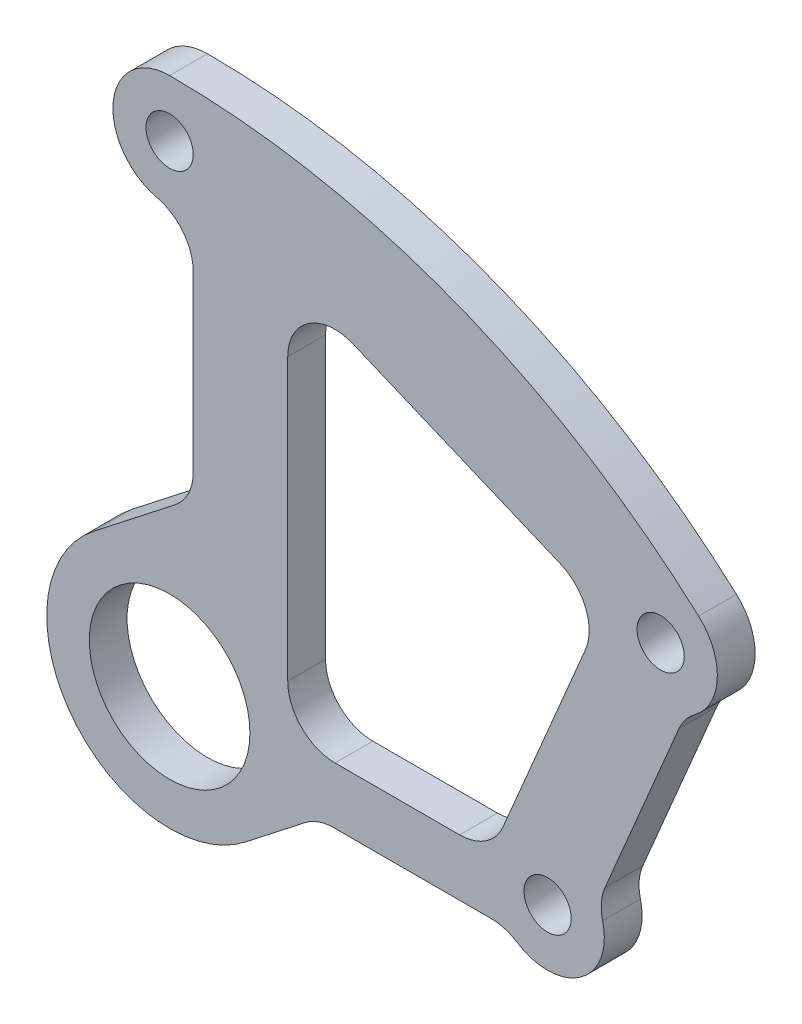
ISO-10303-21;
HEADER;
FILE_DESCRIPTION(('STEP AP214'),'2;1');
FILE_NAME('part.step','',(''),(''),'','','');
FILE_SCHEMA(('AUTOMOTIVE_DESIGN { 1 0 10303 214 1 1 1 1 }'));
ENDSEC;
DATA;
#1=APPLICATION_CONTEXT('core data for automotive mechanical design processes');
#2=APPLICATION_PROTOCOL_DEFINITION('international standard','automotive_design',2000,#1);
#3=PRODUCT_CONTEXT('',#1,'mechanical');
#4=PRODUCT('Part','Part','',(#3));
#5=PRODUCT_RELATED_PRODUCT_CATEGORY('part','',(#4));
#6=PRODUCT_DEFINITION_FORMATION('','',#4);
#7=PRODUCT_DEFINITION_CONTEXT('part definition',#1,'design');
#8=PRODUCT_DEFINITION('design','',#6,#7);
#9=PRODUCT_DEFINITION_SHAPE('','',#8);
#10=(LENGTH_UNIT() NAMED_UNIT(*) SI_UNIT(.MILLI.,.METRE.));
#11=(NAMED_UNIT(*) PLANE_ANGLE_UNIT() SI_UNIT($,.RADIAN.));
#12=(NAMED_UNIT(*) SI_UNIT($,.STERADIAN.) SOLID_ANGLE_UNIT());
#13=UNCERTAINTY_MEASURE_WITH_UNIT(LENGTH_MEASURE(1.E-05),#10,'distance_accuracy_value','');
#14=(GEOMETRIC_REPRESENTATION_CONTEXT(3) GLOBAL_UNCERTAINTY_ASSIGNED_CONTEXT((#13)) GLOBAL_UNIT_ASSIGNED_CONTEXT((#10,
#11,#12)) REPRESENTATION_CONTEXT('',''));
#15=CARTESIAN_POINT('',(0.,0.,0.));
#16=DIRECTION('',(0.,0.,1.));
#17=DIRECTION('',(1.,0.,0.));
#18=AXIS2_PLACEMENT_3D('',#15,#16,#17);
#19=CARTESIAN_POINT('',(0.,0.,4.));
#20=DIRECTION('',(0.,0.,1.));
#21=DIRECTION('',(1.,0.,0.));
#22=AXIS2_PLACEMENT_3D('',#19,#20,#21);
#23=PLANE('',#22);
#24=CARTESIAN_POINT('',(80.,0.,4.));
#25=DIRECTION('',(0.,0.,1.));
#26=DIRECTION('',(1.,0.,0.));
#27=AXIS2_PLACEMENT_3D('',#24,#25,#26);
#28=CIRCLE('',#27,4.99999999999999);
#29=CARTESIAN_POINT('',(85.,0.,4.));
#30=VERTEX_POINT('',#29);
#31=EDGE_CURVE('E266',#30,#30,#28,.T.);
#32=ORIENTED_EDGE('',*,*,#31,.F.);
#33=EDGE_LOOP('',(#32));
#34=FACE_BOUND('',#33,.T.);
#35=CARTESIAN_POINT('',(0.,0.,4.));
#36=DIRECTION('',(0.,0.,1.));
#37=DIRECTION('',(1.,0.,0.));
#38=AXIS2_PLACEMENT_3D('',#35,#36,#37);
#39=CIRCLE('',#38,17.);
#40=CARTESIAN_POINT('',(17.,0.,4.));
#41=VERTEX_POINT('',#40);
#42=EDGE_CURVE('E278',#41,#41,#39,.T.);
#43=ORIENTED_EDGE('',*,*,#42,.F.);
#44=EDGE_LOOP('',(#43));
#45=FACE_BOUND('',#44,.T.);
#46=CARTESIAN_POINT('',(0.,0.,4.));
#47=DIRECTION('',(0.,0.,1.));
#48=DIRECTION('',(1.,0.,0.));
#49=AXIS2_PLACEMENT_3D('',#46,#47,#48);
#50=CIRCLE('',#49,26.);
#51=CARTESIAN_POINT('',(-16.0071983584671,20.4882795937748,4.));
#52=VERTEX_POINT('',#51);
#53=CARTESIAN_POINT('',(16.0071983584671,-20.4882795937748,4.));
#54=VERTEX_POINT('',#53);
#55=EDGE_CURVE('E284',#52,#54,#50,.T.);
#56=ORIENTED_EDGE('',*,*,#55,.T.);
#57=DIRECTION('',(0.788010753606723,0.615661475325657,0.));
#58=VECTOR('',#57,1.);
#59=CARTESIAN_POINT('',(16.0071983584671,-20.4882795937748,4.));
#60=LINE('',#59,#58);
#61=CARTESIAN_POINT('',(28.6569968704309,-10.6051738381714,4.));
#62=VERTEX_POINT('',#61);
#63=EDGE_CURVE('E287',#54,#62,#60,.T.);
#64=ORIENTED_EDGE('',*,*,#63,.T.);
#65=CARTESIAN_POINT('',(34.8136116236875,-18.4852813742387,4.));
#66=DIRECTION('',(0.,0.,-1.));
#67=DIRECTION('',(1.,0.,0.));
#68=AXIS2_PLACEMENT_3D('',#65,#66,#67);
#69=CIRCLE('',#68,10.);
#70=CARTESIAN_POINT('',(34.8136116236875,-8.48528137423866,4.));
#71=VERTEX_POINT('',#70);
#72=EDGE_CURVE('E290',#62,#71,#69,.T.);
#73=ORIENTED_EDGE('',*,*,#72,.T.);
#74=DIRECTION('',(1.,0.,0.));
#75=VECTOR('',#74,1.);
#76=CARTESIAN_POINT('',(68.0712795105583,-8.48528137423865,4.));
#77=LINE('',#76,#75);
#78=CARTESIAN_POINT('',(68.0712795105583,-8.48528137423865,4.));
#79=VERTEX_POINT('',#78);
#80=EDGE_CURVE('E292',#71,#79,#77,.T.);
#81=ORIENTED_EDGE('',*,*,#80,.T.);
#82=CARTESIAN_POINT('',(68.0712795105583,-18.4852813742387,4.));
#83=DIRECTION('',(0.,0.,-1.));
#84=DIRECTION('',(1.,0.,0.));
#85=AXIS2_PLACEMENT_3D('',#82,#83,#84);
#86=CIRCLE('',#85,10.);
#87=CARTESIAN_POINT('',(73.4934251875773,-10.0828807495847,4.));
#88=VERTEX_POINT('',#87);
#89=EDGE_CURVE('E294',#79,#88,#86,.T.);
#90=ORIENTED_EDGE('',*,*,#89,.T.);
#91=CARTESIAN_POINT('',(80.,0.,4.));
#92=DIRECTION('',(0.,0.,1.));
#93=DIRECTION('',(-1.,0.,0.));
#94=AXIS2_PLACEMENT_3D('',#91,#92,#93);
#95=CIRCLE('',#94,12.);
#96=CARTESIAN_POINT('',(91.6432978532744,2.90406871474063,4.));
#97=VERTEX_POINT('',#96);
#98=EDGE_CURVE('E296',#88,#97,#95,.T.);
#99=ORIENTED_EDGE('',*,*,#98,.T.);
#100=CARTESIAN_POINT('',(101.346046064336,5.32412597702448,4.));
#101=DIRECTION('',(0.,0.,-1.));
#102=DIRECTION('',(-1.,0.,0.));
#103=AXIS2_PLACEMENT_3D('',#100,#101,#102);
#104=CIRCLE('',#103,9.99999999999999);
#105=CARTESIAN_POINT('',(92.1378618130365,9.22404171894911,4.));
#106=VERTEX_POINT('',#105);
#107=EDGE_CURVE('E298',#97,#106,#104,.T.);
#108=ORIENTED_EDGE('',*,*,#107,.T.);
#109=DIRECTION('',(0.389991574192462,0.920818425129996,0.));
#110=VECTOR('',#109,1.);
#111=CARTESIAN_POINT('',(107.806206108364,46.2189438480355,4.));
#112=LINE('',#111,#110);
#113=CARTESIAN_POINT('',(107.806206108364,46.2189438480355,4.));
#114=VERTEX_POINT('',#113);
#115=EDGE_CURVE('E300',#106,#114,#112,.T.);
#116=ORIENTED_EDGE('',*,*,#115,.T.);
#117=CARTESIAN_POINT('',(117.014390359664,42.3190281061109,4.));
#118=DIRECTION('',(0.,0.,-1.));
#119=DIRECTION('',(1.,0.,0.));
#120=AXIS2_PLACEMENT_3D('',#117,#118,#119);
#121=CIRCLE('',#120,10.);
#122=CARTESIAN_POINT('',(111.063780402605,50.3558335124238,4.));
#123=VERTEX_POINT('',#122);
#124=EDGE_CURVE('E302',#114,#123,#121,.T.);
#125=ORIENTED_EDGE('',*,*,#124,.T.);
#126=CARTESIAN_POINT('',(103.923048454133,59.9999999999994,4.));
#127=DIRECTION('',(0.,0.,1.));
#128=DIRECTION('',(1.,0.,0.));
#129=AXIS2_PLACEMENT_3D('',#126,#127,#128);
#130=CIRCLE('',#129,12.);
#131=CARTESIAN_POINT('',(111.968703818324,68.9032258064509,4.));
#132=VERTEX_POINT('',#131);
#133=EDGE_CURVE('E304',#123,#132,#130,.T.);
#134=ORIENTED_EDGE('',*,*,#133,.T.);
#135=CARTESIAN_POINT('',(4.30211422042248E-13,-54.9999999999981,4.));
#136=DIRECTION('',(0.,0.,1.));
#137=DIRECTION('',(-1.,0.,0.));
#138=AXIS2_PLACEMENT_3D('',#135,#136,#137);
#139=CIRCLE('',#138,166.999999999998);
#140=CARTESIAN_POINT('',(0.,112.,4.));
#141=VERTEX_POINT('',#140);
#142=EDGE_CURVE('E306',#132,#141,#139,.T.);
#143=ORIENTED_EDGE('',*,*,#142,.T.);
#144=CARTESIAN_POINT('',(0.,100.,4.));
#145=DIRECTION('',(0.,0.,1.));
#146=DIRECTION('',(1.,0.,0.));
#147=AXIS2_PLACEMENT_3D('',#144,#145,#146);
#148=CIRCLE('',#147,12.);
#149=CARTESIAN_POINT('',(-2.72727272727273,88.314026207839,4.));
#150=VERTEX_POINT('',#149);
#151=EDGE_CURVE('E308',#141,#150,#148,.T.);
#152=ORIENTED_EDGE('',*,*,#151,.T.);
#153=CARTESIAN_POINT('',(-5.,78.5757147143715,4.));
#154=DIRECTION('',(0.,0.,-1.));
#155=DIRECTION('',(1.,0.,0.));
#156=AXIS2_PLACEMENT_3D('',#153,#154,#155);
#157=CIRCLE('',#156,10.);
#158=CARTESIAN_POINT('',(5.,78.5757147143715,4.));
#159=VERTEX_POINT('',#158);
#160=EDGE_CURVE('E310',#150,#159,#157,.T.);
#161=ORIENTED_EDGE('',*,*,#160,.T.);
#162=DIRECTION('',(0.,-1.,0.));
#163=VECTOR('',#162,1.);
#164=CARTESIAN_POINT('',(5.,78.5757147143715,4.));
#165=LINE('',#164,#163);
#166=CARTESIAN_POINT('',(5.,41.7782276100792,4.));
#167=VERTEX_POINT('',#166);
#168=EDGE_CURVE('E312',#159,#167,#165,.T.);
#169=ORIENTED_EDGE('',*,*,#168,.T.);
#170=CARTESIAN_POINT('',(-5.,41.7782276100792,4.));
#171=DIRECTION('',(0.,0.,-1.));
#172=DIRECTION('',(1.,0.,0.));
#173=AXIS2_PLACEMENT_3D('',#170,#171,#172);
#174=CIRCLE('',#173,9.99999999999999);
#175=CARTESIAN_POINT('',(1.15661475325657,33.898120074012,4.));
#176=VERTEX_POINT('',#175);
#177=EDGE_CURVE('E314',#167,#176,#174,.T.);
#178=ORIENTED_EDGE('',*,*,#177,.T.);
#179=DIRECTION('',(-0.788010753606723,-0.615661475325658,0.));
#180=VECTOR('',#179,1.);
#181=CARTESIAN_POINT('',(1.15661475325657,33.898120074012,4.));
#182=LINE('',#181,#180);
#183=EDGE_CURVE('E316',#176,#52,#182,.T.);
#184=ORIENTED_EDGE('',*,*,#183,.T.);
#185=EDGE_LOOP('',(#56,#64,#73,#81,#90,#99,#108,#116,#125,#134,#143,#152,#161,#169,#178,#184));
#186=FACE_BOUND('',#185,.T.);
#187=CARTESIAN_POINT('',(0.,100.,4.));
#188=DIRECTION('',(0.,0.,1.));
#189=DIRECTION('',(1.,0.,0.));
#190=AXIS2_PLACEMENT_3D('',#187,#188,#189);
#191=CIRCLE('',#190,5.);
#192=CARTESIAN_POINT('',(5.,100.,4.));
#193=VERTEX_POINT('',#192);
#194=EDGE_CURVE('E272',#193,#193,#191,.T.);
#195=ORIENTED_EDGE('',*,*,#194,.F.);
#196=EDGE_LOOP('',(#195));
#197=FACE_BOUND('',#196,.T.);
#198=CARTESIAN_POINT('',(103.923048454133,59.9999999999994,4.));
#199=DIRECTION('',(0.,0.,1.));
#200=DIRECTION('',(1.,0.,0.));
#201=AXIS2_PLACEMENT_3D('',#198,#199,#200);
#202=CIRCLE('',#201,5.00000000000002);
#203=CARTESIAN_POINT('',(108.923048454133,59.9999999999994,4.));
#204=VERTEX_POINT('',#203);
#205=EDGE_CURVE('E260',#204,#204,#202,.T.);
#206=ORIENTED_EDGE('',*,*,#205,.F.);
#207=EDGE_LOOP('',(#206));
#208=FACE_BOUND('',#207,.T.);
#209=DIRECTION('',(0.,-1.,0.));
#210=VECTOR('',#209,1.);
#211=CARTESIAN_POINT('',(25.,72.9761131709704,4.));
#212=LINE('',#211,#210);
#213=CARTESIAN_POINT('',(25.,72.9761131709704,4.));
#214=VERTEX_POINT('',#213);
#215=CARTESIAN_POINT('',(25.,13.5147186257613,4.));
#216=VERTEX_POINT('',#215);
#217=EDGE_CURVE('E203',#214,#216,#212,.T.);
#218=ORIENTED_EDGE('',*,*,#217,.F.);
#219=CARTESIAN_POINT('',(35.,72.9761131709704,4.));
#220=DIRECTION('',(0.,0.,1.));
#221=DIRECTION('',(-1.,0.,0.));
#222=AXIS2_PLACEMENT_3D('',#219,#220,#221);
#223=CIRCLE('',#222,10.);
#224=CARTESIAN_POINT('',(38.8597035995178,82.2012249927246,4.));
#225=VERTEX_POINT('',#224);
#226=EDGE_CURVE('E195',#225,#214,#223,.T.);
#227=ORIENTED_EDGE('',*,*,#226,.F.);
#228=DIRECTION('',(-0.92251118217542,0.385970359951783,0.));
#229=VECTOR('',#228,1.);
#230=CARTESIAN_POINT('',(82.6575995674588,63.8765802637435,4.));
#231=LINE('',#230,#229);
#232=CARTESIAN_POINT('',(82.6575995674588,63.8765802637436,4.));
#233=VERTEX_POINT('',#232);
#234=EDGE_CURVE('E228',#233,#225,#231,.T.);
#235=ORIENTED_EDGE('',*,*,#234,.F.);
#236=CARTESIAN_POINT('',(78.7978959679409,54.6514684419893,4.));
#237=DIRECTION('',(0.,0.,1.));
#238=DIRECTION('',(1.,0.,0.));
#239=AXIS2_PLACEMENT_3D('',#236,#237,#238);
#240=CIRCLE('',#239,10.);
#241=CARTESIAN_POINT('',(88.0060802192409,50.7515527000647,4.));
#242=VERTEX_POINT('',#241);
#243=EDGE_CURVE('E226',#242,#233,#240,.T.);
#244=ORIENTED_EDGE('',*,*,#243,.F.);
#245=DIRECTION('',(0.389991574192462,0.920818425129995,0.));
#246=VECTOR('',#245,1.);
#247=CARTESIAN_POINT('',(70.5835511080023,9.61480288383671,4.));
#248=LINE('',#247,#246);
#249=CARTESIAN_POINT('',(70.5835511080023,9.61480288383671,4.));
#250=VERTEX_POINT('',#249);
#251=EDGE_CURVE('E224',#250,#242,#248,.T.);
#252=ORIENTED_EDGE('',*,*,#251,.F.);
#253=CARTESIAN_POINT('',(61.3753668567023,13.5147186257613,4.));
#254=DIRECTION('',(0.,0.,1.));
#255=DIRECTION('',(1.,0.,0.));
#256=AXIS2_PLACEMENT_3D('',#253,#254,#255);
#257=CIRCLE('',#256,10.);
#258=CARTESIAN_POINT('',(61.3753668567023,3.51471862576134,4.));
#259=VERTEX_POINT('',#258);
#260=EDGE_CURVE('E222',#259,#250,#257,.T.);
#261=ORIENTED_EDGE('',*,*,#260,.F.);
#262=DIRECTION('',(1.,0.,0.));
#263=VECTOR('',#262,1.);
#264=CARTESIAN_POINT('',(35.,3.51471862576134,4.));
#265=LINE('',#264,#263);
#266=CARTESIAN_POINT('',(35.,3.51471862576134,4.));
#267=VERTEX_POINT('',#266);
#268=EDGE_CURVE('E218',#267,#259,#265,.T.);
#269=ORIENTED_EDGE('',*,*,#268,.F.);
#270=CARTESIAN_POINT('',(35.,13.5147186257613,4.));
#271=DIRECTION('',(0.,0.,1.));
#272=DIRECTION('',(-1.,0.,0.));
#273=AXIS2_PLACEMENT_3D('',#270,#271,#272);
#274=CIRCLE('',#273,10.);
#275=EDGE_CURVE('E216',#216,#267,#274,.T.);
#276=ORIENTED_EDGE('',*,*,#275,.F.);
#277=EDGE_LOOP('',(#218,#227,#235,#244,#252,#261,#269,#276));
#278=FACE_BOUND('',#277,.T.);
#279=ADVANCED_FACE('F34',(#34,#45,#186,#197,#208,#278),#23,.T.);
#280=CARTESIAN_POINT('',(0.,0.,-4.));
#281=DIRECTION('',(0.,0.,1.));
#282=DIRECTION('',(1.,0.,0.));
#283=AXIS2_PLACEMENT_3D('',#280,#281,#282);
#284=PLANE('',#283);
#285=CARTESIAN_POINT('',(103.923048454133,59.9999999999994,-4.));
#286=DIRECTION('',(0.,0.,1.));
#287=DIRECTION('',(1.,0.,0.));
#288=AXIS2_PLACEMENT_3D('',#285,#286,#287);
#289=CIRCLE('',#288,5.00000000000002);
#290=CARTESIAN_POINT('',(108.923048454133,59.9999999999994,-4.));
#291=VERTEX_POINT('',#290);
#292=EDGE_CURVE('E211',#291,#291,#289,.T.);
#293=ORIENTED_EDGE('',*,*,#292,.T.);
#294=EDGE_LOOP('',(#293));
#295=FACE_BOUND('',#294,.T.);
#296=CARTESIAN_POINT('',(80.,0.,-4.));
#297=DIRECTION('',(0.,0.,1.));
#298=DIRECTION('',(1.,0.,0.));
#299=AXIS2_PLACEMENT_3D('',#296,#297,#298);
#300=CIRCLE('',#299,4.99999999999999);
#301=CARTESIAN_POINT('',(85.,0.,-4.));
#302=VERTEX_POINT('',#301);
#303=EDGE_CURVE('E263',#302,#302,#300,.T.);
#304=ORIENTED_EDGE('',*,*,#303,.T.);
#305=EDGE_LOOP('',(#304));
#306=FACE_BOUND('',#305,.T.);
#307=CARTESIAN_POINT('',(0.,100.,-4.));
#308=DIRECTION('',(0.,0.,1.));
#309=DIRECTION('',(1.,0.,0.));
#310=AXIS2_PLACEMENT_3D('',#307,#308,#309);
#311=CIRCLE('',#310,5.);
#312=CARTESIAN_POINT('',(5.,100.,-4.));
#313=VERTEX_POINT('',#312);
#314=EDGE_CURVE('E269',#313,#313,#311,.T.);
#315=ORIENTED_EDGE('',*,*,#314,.T.);
#316=EDGE_LOOP('',(#315));
#317=FACE_BOUND('',#316,.T.);
#318=CARTESIAN_POINT('',(0.,0.,-4.));
#319=DIRECTION('',(0.,0.,1.));
#320=DIRECTION('',(1.,0.,0.));
#321=AXIS2_PLACEMENT_3D('',#318,#319,#320);
#322=CIRCLE('',#321,17.);
#323=CARTESIAN_POINT('',(17.,0.,-4.));
#324=VERTEX_POINT('',#323);
#325=EDGE_CURVE('E275',#324,#324,#322,.T.);
#326=ORIENTED_EDGE('',*,*,#325,.T.);
#327=EDGE_LOOP('',(#326));
#328=FACE_BOUND('',#327,.T.);
#329=CARTESIAN_POINT('',(0.,0.,-4.));
#330=DIRECTION('',(0.,0.,1.));
#331=DIRECTION('',(1.,0.,0.));
#332=AXIS2_PLACEMENT_3D('',#329,#330,#331);
#333=CIRCLE('',#332,26.);
#334=CARTESIAN_POINT('',(-16.0071983584671,20.4882795937748,-4.));
#335=VERTEX_POINT('',#334);
#336=CARTESIAN_POINT('',(16.0071983584671,-20.4882795937748,-4.));
#337=VERTEX_POINT('',#336);
#338=EDGE_CURVE('E281',#335,#337,#333,.T.);
#339=ORIENTED_EDGE('',*,*,#338,.F.);
#340=DIRECTION('',(-0.788010753606723,-0.615661475325658,0.));
#341=VECTOR('',#340,1.);
#342=CARTESIAN_POINT('',(1.15661475325657,33.898120074012,-4.));
#343=LINE('',#342,#341);
#344=CARTESIAN_POINT('',(1.15661475325657,33.898120074012,-4.));
#345=VERTEX_POINT('',#344);
#346=EDGE_CURVE('E288',#345,#335,#343,.T.);
#347=ORIENTED_EDGE('',*,*,#346,.F.);
#348=CARTESIAN_POINT('',(-5.,41.7782276100792,-4.));
#349=DIRECTION('',(0.,0.,-1.));
#350=DIRECTION('',(1.,0.,0.));
#351=AXIS2_PLACEMENT_3D('',#348,#349,#350);
#352=CIRCLE('',#351,9.99999999999999);
#353=CARTESIAN_POINT('',(5.,41.7782276100792,-4.));
#354=VERTEX_POINT('',#353);
#355=EDGE_CURVE('E347',#354,#345,#352,.T.);
#356=ORIENTED_EDGE('',*,*,#355,.F.);
#357=DIRECTION('',(0.,-1.,0.));
#358=VECTOR('',#357,1.);
#359=CARTESIAN_POINT('',(5.,78.5757147143715,-4.));
#360=LINE('',#359,#358);
#361=CARTESIAN_POINT('',(5.,78.5757147143715,-4.));
#362=VERTEX_POINT('',#361);
#363=EDGE_CURVE('E345',#362,#354,#360,.T.);
#364=ORIENTED_EDGE('',*,*,#363,.F.);
#365=CARTESIAN_POINT('',(-5.,78.5757147143715,-4.));
#366=DIRECTION('',(0.,0.,-1.));
#367=DIRECTION('',(1.,0.,0.));
#368=AXIS2_PLACEMENT_3D('',#365,#366,#367);
#369=CIRCLE('',#368,10.);
#370=CARTESIAN_POINT('',(-2.72727272727273,88.314026207839,-4.));
#371=VERTEX_POINT('',#370);
#372=EDGE_CURVE('E343',#371,#362,#369,.T.);
#373=ORIENTED_EDGE('',*,*,#372,.F.);
#374=CARTESIAN_POINT('',(0.,100.,-4.));
#375=DIRECTION('',(0.,0.,1.));
#376=DIRECTION('',(1.,0.,0.));
#377=AXIS2_PLACEMENT_3D('',#374,#375,#376);
#378=CIRCLE('',#377,12.);
#379=CARTESIAN_POINT('',(0.,112.,-4.));
#380=VERTEX_POINT('',#379);
#381=EDGE_CURVE('E341',#380,#371,#378,.T.);
#382=ORIENTED_EDGE('',*,*,#381,.F.);
#383=CARTESIAN_POINT('',(4.30211422042248E-13,-54.9999999999981,-4.));
#384=DIRECTION('',(0.,0.,1.));
#385=DIRECTION('',(-1.,0.,0.));
#386=AXIS2_PLACEMENT_3D('',#383,#384,#385);
#387=CIRCLE('',#386,166.999999999998);
#388=CARTESIAN_POINT('',(111.968703818324,68.9032258064509,-4.));
#389=VERTEX_POINT('',#388);
#390=EDGE_CURVE('E339',#389,#380,#387,.T.);
#391=ORIENTED_EDGE('',*,*,#390,.F.);
#392=CARTESIAN_POINT('',(103.923048454133,59.9999999999994,-4.));
#393=DIRECTION('',(0.,0.,1.));
#394=DIRECTION('',(1.,0.,0.));
#395=AXIS2_PLACEMENT_3D('',#392,#393,#394);
#396=CIRCLE('',#395,12.);
#397=CARTESIAN_POINT('',(111.063780402605,50.3558335124238,-4.));
#398=VERTEX_POINT('',#397);
#399=EDGE_CURVE('E337',#398,#389,#396,.T.);
#400=ORIENTED_EDGE('',*,*,#399,.F.);
#401=CARTESIAN_POINT('',(117.014390359664,42.3190281061109,-4.));
#402=DIRECTION('',(0.,0.,-1.));
#403=DIRECTION('',(1.,0.,0.));
#404=AXIS2_PLACEMENT_3D('',#401,#402,#403);
#405=CIRCLE('',#404,10.);
#406=CARTESIAN_POINT('',(107.806206108364,46.2189438480355,-4.));
#407=VERTEX_POINT('',#406);
#408=EDGE_CURVE('E335',#407,#398,#405,.T.);
#409=ORIENTED_EDGE('',*,*,#408,.F.);
#410=DIRECTION('',(0.389991574192462,0.920818425129996,0.));
#411=VECTOR('',#410,1.);
#412=CARTESIAN_POINT('',(107.806206108364,46.2189438480355,-4.));
#413=LINE('',#412,#411);
#414=CARTESIAN_POINT('',(92.1378618130365,9.22404171894911,-4.));
#415=VERTEX_POINT('',#414);
#416=EDGE_CURVE('E333',#415,#407,#413,.T.);
#417=ORIENTED_EDGE('',*,*,#416,.F.);
#418=CARTESIAN_POINT('',(101.346046064336,5.32412597702448,-4.));
#419=DIRECTION('',(0.,0.,-1.));
#420=DIRECTION('',(-1.,0.,0.));
#421=AXIS2_PLACEMENT_3D('',#418,#419,#420);
#422=CIRCLE('',#421,9.99999999999999);
#423=CARTESIAN_POINT('',(91.6432978532744,2.90406871474063,-4.));
#424=VERTEX_POINT('',#423);
#425=EDGE_CURVE('E331',#424,#415,#422,.T.);
#426=ORIENTED_EDGE('',*,*,#425,.F.);
#427=CARTESIAN_POINT('',(80.,0.,-4.));
#428=DIRECTION('',(0.,0.,1.));
#429=DIRECTION('',(-1.,0.,0.));
#430=AXIS2_PLACEMENT_3D('',#427,#428,#429);
#431=CIRCLE('',#430,12.);
#432=CARTESIAN_POINT('',(73.4934251875773,-10.0828807495847,-4.));
#433=VERTEX_POINT('',#432);
#434=EDGE_CURVE('E329',#433,#424,#431,.T.);
#435=ORIENTED_EDGE('',*,*,#434,.F.);
#436=CARTESIAN_POINT('',(68.0712795105583,-18.4852813742387,-4.));
#437=DIRECTION('',(0.,0.,-1.));
#438=DIRECTION('',(1.,0.,0.));
#439=AXIS2_PLACEMENT_3D('',#436,#437,#438);
#440=CIRCLE('',#439,10.);
#441=CARTESIAN_POINT('',(68.0712795105583,-8.48528137423865,-4.));
#442=VERTEX_POINT('',#441);
#443=EDGE_CURVE('E327',#442,#433,#440,.T.);
#444=ORIENTED_EDGE('',*,*,#443,.F.);
#445=DIRECTION('',(1.,0.,0.));
#446=VECTOR('',#445,1.);
#447=CARTESIAN_POINT('',(68.0712795105583,-8.48528137423865,-4.));
#448=LINE('',#447,#446);
#449=CARTESIAN_POINT('',(34.8136116236875,-8.48528137423866,-4.));
#450=VERTEX_POINT('',#449);
#451=EDGE_CURVE('E325',#450,#442,#448,.T.);
#452=ORIENTED_EDGE('',*,*,#451,.F.);
#453=CARTESIAN_POINT('',(34.8136116236875,-18.4852813742387,-4.));
#454=DIRECTION('',(0.,0.,-1.));
#455=DIRECTION('',(1.,0.,0.));
#456=AXIS2_PLACEMENT_3D('',#453,#454,#455);
#457=CIRCLE('',#456,10.);
#458=CARTESIAN_POINT('',(28.6569968704309,-10.6051738381714,-4.));
#459=VERTEX_POINT('',#458);
#460=EDGE_CURVE('E323',#459,#450,#457,.T.);
#461=ORIENTED_EDGE('',*,*,#460,.F.);
#462=DIRECTION('',(0.788010753606723,0.615661475325657,0.));
#463=VECTOR('',#462,1.);
#464=CARTESIAN_POINT('',(16.0071983584671,-20.4882795937748,-4.));
#465=LINE('',#464,#463);
#466=EDGE_CURVE('E321',#337,#459,#465,.T.);
#467=ORIENTED_EDGE('',*,*,#466,.F.);
#468=EDGE_LOOP('',(#339,#347,#356,#364,#373,#382,#391,#400,#409,#417,#426,#435,#444,#452,#461,#467));
#469=FACE_BOUND('',#468,.T.);
#470=CARTESIAN_POINT('',(35.,72.9761131709704,-4.));
#471=DIRECTION('',(0.,0.,1.));
#472=DIRECTION('',(-1.,0.,0.));
#473=AXIS2_PLACEMENT_3D('',#470,#471,#472);
#474=CIRCLE('',#473,10.);
#475=CARTESIAN_POINT('',(38.8597035995178,82.2012249927246,-4.));
#476=VERTEX_POINT('',#475);
#477=CARTESIAN_POINT('',(25.,72.9761131709704,-4.));
#478=VERTEX_POINT('',#477);
#479=EDGE_CURVE('E57',#476,#478,#474,.T.);
#480=ORIENTED_EDGE('',*,*,#479,.T.);
#481=DIRECTION('',(0.,-1.,0.));
#482=VECTOR('',#481,1.);
#483=CARTESIAN_POINT('',(25.,72.9761131709704,-4.));
#484=LINE('',#483,#482);
#485=CARTESIAN_POINT('',(25.,13.5147186257613,-4.));
#486=VERTEX_POINT('',#485);
#487=EDGE_CURVE('E210',#478,#486,#484,.T.);
#488=ORIENTED_EDGE('',*,*,#487,.T.);
#489=CARTESIAN_POINT('',(35.,13.5147186257613,-4.));
#490=DIRECTION('',(0.,0.,1.));
#491=DIRECTION('',(-1.,0.,0.));
#492=AXIS2_PLACEMENT_3D('',#489,#490,#491);
#493=CIRCLE('',#492,10.);
#494=CARTESIAN_POINT('',(35.,3.51471862576134,-4.));
#495=VERTEX_POINT('',#494);
#496=EDGE_CURVE('E232',#486,#495,#493,.T.);
#497=ORIENTED_EDGE('',*,*,#496,.T.);
#498=DIRECTION('',(1.,0.,0.));
#499=VECTOR('',#498,1.);
#500=CARTESIAN_POINT('',(35.,3.51471862576134,-4.));
#501=LINE('',#500,#499);
#502=CARTESIAN_POINT('',(61.3753668567023,3.51471862576134,-4.));
#503=VERTEX_POINT('',#502);
#504=EDGE_CURVE('E235',#495,#503,#501,.T.);
#505=ORIENTED_EDGE('',*,*,#504,.T.);
#506=CARTESIAN_POINT('',(61.3753668567023,13.5147186257613,-4.));
#507=DIRECTION('',(0.,0.,1.));
#508=DIRECTION('',(1.,0.,0.));
#509=AXIS2_PLACEMENT_3D('',#506,#507,#508);
#510=CIRCLE('',#509,10.);
#511=CARTESIAN_POINT('',(70.5835511080023,9.61480288383671,-4.));
#512=VERTEX_POINT('',#511);
#513=EDGE_CURVE('E238',#503,#512,#510,.T.);
#514=ORIENTED_EDGE('',*,*,#513,.T.);
#515=DIRECTION('',(0.389991574192462,0.920818425129995,0.));
#516=VECTOR('',#515,1.);
#517=CARTESIAN_POINT('',(70.5835511080023,9.61480288383671,-4.));
#518=LINE('',#517,#516);
#519=CARTESIAN_POINT('',(88.0060802192409,50.7515527000647,-4.));
#520=VERTEX_POINT('',#519);
#521=EDGE_CURVE('E241',#512,#520,#518,.T.);
#522=ORIENTED_EDGE('',*,*,#521,.T.);
#523=CARTESIAN_POINT('',(78.7978959679409,54.6514684419893,-4.));
#524=DIRECTION('',(0.,0.,1.));
#525=DIRECTION('',(1.,0.,0.));
#526=AXIS2_PLACEMENT_3D('',#523,#524,#525);
#527=CIRCLE('',#526,10.);
#528=CARTESIAN_POINT('',(82.6575995674588,63.8765802637435,-4.));
#529=VERTEX_POINT('',#528);
#530=EDGE_CURVE('E244',#520,#529,#527,.T.);
#531=ORIENTED_EDGE('',*,*,#530,.T.);
#532=DIRECTION('',(-0.92251118217542,0.385970359951783,0.));
#533=VECTOR('',#532,1.);
#534=CARTESIAN_POINT('',(82.6575995674588,63.8765802637435,-4.));
#535=LINE('',#534,#533);
#536=EDGE_CURVE('E204',#529,#476,#535,.T.);
#537=ORIENTED_EDGE('',*,*,#536,.T.);
#538=EDGE_LOOP('',(#480,#488,#497,#505,#514,#522,#531,#537));
#539=FACE_BOUND('',#538,.T.);
#540=ADVANCED_FACE('F401',(#295,#306,#317,#328,#469,#539),#284,.F.);
#541=CARTESIAN_POINT('',(0.,0.,4.));
#542=DIRECTION('',(0.,0.,-1.));
#543=DIRECTION('',(-1.,0.,0.));
#544=AXIS2_PLACEMENT_3D('',#541,#542,#543);
#545=CYLINDRICAL_SURFACE('',#544,26.);
#546=ORIENTED_EDGE('',*,*,#338,.T.);
#547=DIRECTION('',(0.,0.,-1.));
#548=VECTOR('',#547,1.);
#549=CARTESIAN_POINT('',(16.0071983584671,-20.4882795937748,4.));
#550=LINE('',#549,#548);
#551=EDGE_CURVE('E11',#54,#337,#550,.T.);
#552=ORIENTED_EDGE('',*,*,#551,.F.);
#553=ORIENTED_EDGE('',*,*,#55,.F.);
#554=DIRECTION('',(0.,0.,-1.));
#555=VECTOR('',#554,1.);
#556=CARTESIAN_POINT('',(-16.0071983584671,20.4882795937748,4.));
#557=LINE('',#556,#555);
#558=EDGE_CURVE('E318',#52,#335,#557,.T.);
#559=ORIENTED_EDGE('',*,*,#558,.T.);
#560=EDGE_LOOP('',(#546,#552,#553,#559));
#561=FACE_BOUND('',#560,.T.);
#562=ADVANCED_FACE('F36',(#561),#545,.T.);
#563=CARTESIAN_POINT('',(16.0071983584671,-20.4882795937748,4.));
#564=DIRECTION('',(-0.615661475325657,0.788010753606723,0.));
#565=DIRECTION('',(-0.788010753606723,-0.615661475325657,0.));
#566=AXIS2_PLACEMENT_3D('',#563,#564,#565);
#567=PLANE('',#566);
#568=ORIENTED_EDGE('',*,*,#466,.T.);
#569=DIRECTION('',(0.,0.,-1.));
#570=VECTOR('',#569,1.);
#571=CARTESIAN_POINT('',(28.6569968704309,-10.6051738381714,4.));
#572=LINE('',#571,#570);
#573=EDGE_CURVE('E42',#62,#459,#572,.T.);
#574=ORIENTED_EDGE('',*,*,#573,.F.);
#575=ORIENTED_EDGE('',*,*,#63,.F.);
#576=ORIENTED_EDGE('',*,*,#551,.T.);
#577=EDGE_LOOP('',(#568,#574,#575,#576));
#578=FACE_BOUND('',#577,.T.);
#579=ADVANCED_FACE('F419',(#578),#567,.F.);
#580=CARTESIAN_POINT('',(34.8136116236875,-18.4852813742387,4.));
#581=DIRECTION('',(0.,0.,-1.));
#582=DIRECTION('',(-1.,0.,0.));
#583=AXIS2_PLACEMENT_3D('',#580,#581,#582);
#584=CYLINDRICAL_SURFACE('',#583,10.);
#585=ORIENTED_EDGE('',*,*,#460,.T.);
#586=DIRECTION('',(0.,0.,-1.));
#587=VECTOR('',#586,1.);
#588=CARTESIAN_POINT('',(34.8136116236875,-8.48528137423866,4.));
#589=LINE('',#588,#587);
#590=EDGE_CURVE('E388',#71,#450,#589,.T.);
#591=ORIENTED_EDGE('',*,*,#590,.F.);
#592=ORIENTED_EDGE('',*,*,#72,.F.);
#593=ORIENTED_EDGE('',*,*,#573,.T.);
#594=EDGE_LOOP('',(#585,#591,#592,#593));
#595=FACE_BOUND('',#594,.T.);
#596=ADVANCED_FACE('F395',(#595),#584,.F.);
#597=CARTESIAN_POINT('',(68.0712795105583,-8.48528137423865,4.));
#598=DIRECTION('',(0.,1.,0.));
#599=DIRECTION('',(-1.,0.,0.));
#600=AXIS2_PLACEMENT_3D('',#597,#598,#599);
#601=PLANE('',#600);
#602=ORIENTED_EDGE('',*,*,#451,.T.);
#603=DIRECTION('',(0.,0.,-1.));
#604=VECTOR('',#603,1.);
#605=CARTESIAN_POINT('',(68.0712795105583,-8.48528137423865,4.));
#606=LINE('',#605,#604);
#607=EDGE_CURVE('E385',#79,#442,#606,.T.);
#608=ORIENTED_EDGE('',*,*,#607,.F.);
#609=ORIENTED_EDGE('',*,*,#80,.F.);
#610=ORIENTED_EDGE('',*,*,#590,.T.);
#611=EDGE_LOOP('',(#602,#608,#609,#610));
#612=FACE_BOUND('',#611,.T.);
#613=ADVANCED_FACE('F407',(#612),#601,.F.);
#614=CARTESIAN_POINT('',(68.0712795105583,-18.4852813742387,4.));
#615=DIRECTION('',(0.,0.,-1.));
#616=DIRECTION('',(-1.,0.,0.));
#617=AXIS2_PLACEMENT_3D('',#614,#615,#616);
#618=CYLINDRICAL_SURFACE('',#617,10.);
#619=ORIENTED_EDGE('',*,*,#443,.T.);
#620=DIRECTION('',(0.,0.,-1.));
#621=VECTOR('',#620,1.);
#622=CARTESIAN_POINT('',(73.4934251875773,-10.0828807495847,4.));
#623=LINE('',#622,#621);
#624=EDGE_CURVE('E382',#88,#433,#623,.T.);
#625=ORIENTED_EDGE('',*,*,#624,.F.);
#626=ORIENTED_EDGE('',*,*,#89,.F.);
#627=ORIENTED_EDGE('',*,*,#607,.T.);
#628=EDGE_LOOP('',(#619,#625,#626,#627));
#629=FACE_BOUND('',#628,.T.);
#630=ADVANCED_FACE('F411',(#629),#618,.F.);
#631=CARTESIAN_POINT('',(80.,0.,4.));
#632=DIRECTION('',(0.,0.,-1.));
#633=DIRECTION('',(-1.,0.,0.));
#634=AXIS2_PLACEMENT_3D('',#631,#632,#633);
#635=CYLINDRICAL_SURFACE('',#634,12.);
#636=ORIENTED_EDGE('',*,*,#434,.T.);
#637=DIRECTION('',(0.,0.,-1.));
#638=VECTOR('',#637,1.);
#639=CARTESIAN_POINT('',(91.6432978532744,2.90406871474063,4.));
#640=LINE('',#639,#638);
#641=EDGE_CURVE('E379',#97,#424,#640,.T.);
#642=ORIENTED_EDGE('',*,*,#641,.F.);
#643=ORIENTED_EDGE('',*,*,#98,.F.);
#644=ORIENTED_EDGE('',*,*,#624,.T.);
#645=EDGE_LOOP('',(#636,#642,#643,#644));
#646=FACE_BOUND('',#645,.T.);
#647=ADVANCED_FACE('F472',(#646),#635,.T.);
#648=CARTESIAN_POINT('',(101.346046064336,5.32412597702448,4.));
#649=DIRECTION('',(0.,0.,-1.));
#650=DIRECTION('',(-1.,0.,0.));
#651=AXIS2_PLACEMENT_3D('',#648,#649,#650);
#652=CYLINDRICAL_SURFACE('',#651,9.99999999999999);
#653=ORIENTED_EDGE('',*,*,#425,.T.);
#654=DIRECTION('',(0.,0.,-1.));
#655=VECTOR('',#654,1.);
#656=CARTESIAN_POINT('',(92.1378618130365,9.22404171894911,4.));
#657=LINE('',#656,#655);
#658=EDGE_CURVE('E376',#106,#415,#657,.T.);
#659=ORIENTED_EDGE('',*,*,#658,.F.);
#660=ORIENTED_EDGE('',*,*,#107,.F.);
#661=ORIENTED_EDGE('',*,*,#641,.T.);
#662=EDGE_LOOP('',(#653,#659,#660,#661));
#663=FACE_BOUND('',#662,.T.);
#664=ADVANCED_FACE('F469',(#663),#652,.F.);
#665=CARTESIAN_POINT('',(107.806206108364,46.2189438480355,4.));
#666=DIRECTION('',(-0.920818425129996,0.389991574192462,0.));
#667=DIRECTION('',(-0.389991574192462,-0.920818425129996,0.));
#668=AXIS2_PLACEMENT_3D('',#665,#666,#667);
#669=PLANE('',#668);
#670=ORIENTED_EDGE('',*,*,#416,.T.);
#671=DIRECTION('',(0.,0.,-1.));
#672=VECTOR('',#671,1.);
#673=CARTESIAN_POINT('',(107.806206108364,46.2189438480355,4.));
#674=LINE('',#673,#672);
#675=EDGE_CURVE('E373',#114,#407,#674,.T.);
#676=ORIENTED_EDGE('',*,*,#675,.F.);
#677=ORIENTED_EDGE('',*,*,#115,.F.);
#678=ORIENTED_EDGE('',*,*,#658,.T.);
#679=EDGE_LOOP('',(#670,#676,#677,#678));
#680=FACE_BOUND('',#679,.T.);
#681=ADVANCED_FACE('F465',(#680),#669,.F.);
#682=CARTESIAN_POINT('',(117.014390359664,42.3190281061109,4.));
#683=DIRECTION('',(0.,0.,-1.));
#684=DIRECTION('',(-1.,0.,0.));
#685=AXIS2_PLACEMENT_3D('',#682,#683,#684);
#686=CYLINDRICAL_SURFACE('',#685,10.);
#687=ORIENTED_EDGE('',*,*,#408,.T.);
#688=DIRECTION('',(0.,0.,-1.));
#689=VECTOR('',#688,1.);
#690=CARTESIAN_POINT('',(111.063780402605,50.3558335124238,4.));
#691=LINE('',#690,#689);
#692=EDGE_CURVE('E370',#123,#398,#691,.T.);
#693=ORIENTED_EDGE('',*,*,#692,.F.);
#694=ORIENTED_EDGE('',*,*,#124,.F.);
#695=ORIENTED_EDGE('',*,*,#675,.T.);
#696=EDGE_LOOP('',(#687,#693,#694,#695));
#697=FACE_BOUND('',#696,.T.);
#698=ADVANCED_FACE('F461',(#697),#686,.F.);
#699=CARTESIAN_POINT('',(103.923048454133,59.9999999999994,4.));
#700=DIRECTION('',(0.,0.,-1.));
#701=DIRECTION('',(-1.,0.,0.));
#702=AXIS2_PLACEMENT_3D('',#699,#700,#701);
#703=CYLINDRICAL_SURFACE('',#702,12.);
#704=ORIENTED_EDGE('',*,*,#399,.T.);
#705=DIRECTION('',(0.,0.,-1.));
#706=VECTOR('',#705,1.);
#707=CARTESIAN_POINT('',(111.968703818324,68.9032258064509,4.));
#708=LINE('',#707,#706);
#709=EDGE_CURVE('E367',#132,#389,#708,.T.);
#710=ORIENTED_EDGE('',*,*,#709,.F.);
#711=ORIENTED_EDGE('',*,*,#133,.F.);
#712=ORIENTED_EDGE('',*,*,#692,.T.);
#713=EDGE_LOOP('',(#704,#710,#711,#712));
#714=FACE_BOUND('',#713,.T.);
#715=ADVANCED_FACE('F456',(#714),#703,.T.);
#716=CARTESIAN_POINT('',(4.30211422042248E-13,-54.9999999999981,4.));
#717=DIRECTION('',(0.,0.,-1.));
#718=DIRECTION('',(-1.,0.,0.));
#719=AXIS2_PLACEMENT_3D('',#716,#717,#718);
#720=CYLINDRICAL_SURFACE('',#719,166.999999999998);
#721=ORIENTED_EDGE('',*,*,#390,.T.);
#722=DIRECTION('',(0.,0.,-1.));
#723=VECTOR('',#722,1.);
#724=CARTESIAN_POINT('',(0.,112.,4.));
#725=LINE('',#724,#723);
#726=EDGE_CURVE('E364',#141,#380,#725,.T.);
#727=ORIENTED_EDGE('',*,*,#726,.F.);
#728=ORIENTED_EDGE('',*,*,#142,.F.);
#729=ORIENTED_EDGE('',*,*,#709,.T.);
#730=EDGE_LOOP('',(#721,#727,#728,#729));
#731=FACE_BOUND('',#730,.T.);
#732=ADVANCED_FACE('F450',(#731),#720,.T.);
#733=CARTESIAN_POINT('',(0.,100.,4.));
#734=DIRECTION('',(0.,0.,-1.));
#735=DIRECTION('',(-1.,0.,0.));
#736=AXIS2_PLACEMENT_3D('',#733,#734,#735);
#737=CYLINDRICAL_SURFACE('',#736,12.);
#738=ORIENTED_EDGE('',*,*,#381,.T.);
#739=DIRECTION('',(0.,0.,-1.));
#740=VECTOR('',#739,1.);
#741=CARTESIAN_POINT('',(-2.72727272727273,88.314026207839,4.));
#742=LINE('',#741,#740);
#743=EDGE_CURVE('E361',#150,#371,#742,.T.);
#744=ORIENTED_EDGE('',*,*,#743,.F.);
#745=ORIENTED_EDGE('',*,*,#151,.F.);
#746=ORIENTED_EDGE('',*,*,#726,.T.);
#747=EDGE_LOOP('',(#738,#744,#745,#746));
#748=FACE_BOUND('',#747,.T.);
#749=ADVANCED_FACE('F446',(#748),#737,.T.);
#750=CARTESIAN_POINT('',(-5.,78.5757147143715,4.));
#751=DIRECTION('',(0.,0.,-1.));
#752=DIRECTION('',(-1.,0.,0.));
#753=AXIS2_PLACEMENT_3D('',#750,#751,#752);
#754=CYLINDRICAL_SURFACE('',#753,10.);
#755=ORIENTED_EDGE('',*,*,#372,.T.);
#756=DIRECTION('',(0.,0.,-1.));
#757=VECTOR('',#756,1.);
#758=CARTESIAN_POINT('',(5.,78.5757147143715,4.));
#759=LINE('',#758,#757);
#760=EDGE_CURVE('E358',#159,#362,#759,.T.);
#761=ORIENTED_EDGE('',*,*,#760,.F.);
#762=ORIENTED_EDGE('',*,*,#160,.F.);
#763=ORIENTED_EDGE('',*,*,#743,.T.);
#764=EDGE_LOOP('',(#755,#761,#762,#763));
#765=FACE_BOUND('',#764,.T.);
#766=ADVANCED_FACE('F441',(#765),#754,.F.);
#767=CARTESIAN_POINT('',(5.,78.5757147143715,4.));
#768=DIRECTION('',(1.,0.,0.));
#769=DIRECTION('',(0.,1.,0.));
#770=AXIS2_PLACEMENT_3D('',#767,#768,#769);
#771=PLANE('',#770);
#772=ORIENTED_EDGE('',*,*,#363,.T.);
#773=DIRECTION('',(0.,0.,-1.));
#774=VECTOR('',#773,1.);
#775=CARTESIAN_POINT('',(5.,41.7782276100792,4.));
#776=LINE('',#775,#774);
#777=EDGE_CURVE('E355',#167,#354,#776,.T.);
#778=ORIENTED_EDGE('',*,*,#777,.F.);
#779=ORIENTED_EDGE('',*,*,#168,.F.);
#780=ORIENTED_EDGE('',*,*,#760,.T.);
#781=EDGE_LOOP('',(#772,#778,#779,#780));
#782=FACE_BOUND('',#781,.T.);
#783=ADVANCED_FACE('F435',(#782),#771,.F.);
#784=CARTESIAN_POINT('',(-5.,41.7782276100792,4.));
#785=DIRECTION('',(0.,0.,-1.));
#786=DIRECTION('',(-1.,0.,0.));
#787=AXIS2_PLACEMENT_3D('',#784,#785,#786);
#788=CYLINDRICAL_SURFACE('',#787,9.99999999999999);
#789=ORIENTED_EDGE('',*,*,#355,.T.);
#790=DIRECTION('',(0.,0.,-1.));
#791=VECTOR('',#790,1.);
#792=CARTESIAN_POINT('',(1.15661475325657,33.898120074012,4.));
#793=LINE('',#792,#791);
#794=EDGE_CURVE('E352',#176,#345,#793,.T.);
#795=ORIENTED_EDGE('',*,*,#794,.F.);
#796=ORIENTED_EDGE('',*,*,#177,.F.);
#797=ORIENTED_EDGE('',*,*,#777,.T.);
#798=EDGE_LOOP('',(#789,#795,#796,#797));
#799=FACE_BOUND('',#798,.T.);
#800=ADVANCED_FACE('F431',(#799),#788,.F.);
#801=CARTESIAN_POINT('',(1.15661475325657,33.898120074012,4.));
#802=DIRECTION('',(0.615661475325658,-0.788010753606723,0.));
#803=DIRECTION('',(0.788010753606723,0.615661475325658,0.));
#804=AXIS2_PLACEMENT_3D('',#801,#802,#803);
#805=PLANE('',#804);
#806=ORIENTED_EDGE('',*,*,#346,.T.);
#807=ORIENTED_EDGE('',*,*,#558,.F.);
#808=ORIENTED_EDGE('',*,*,#183,.F.);
#809=ORIENTED_EDGE('',*,*,#794,.T.);
#810=EDGE_LOOP('',(#806,#807,#808,#809));
#811=FACE_BOUND('',#810,.T.);
#812=ADVANCED_FACE('F426',(#811),#805,.F.);
#813=CARTESIAN_POINT('',(0.,0.,4.));
#814=DIRECTION('',(0.,0.,-1.));
#815=DIRECTION('',(-1.,0.,0.));
#816=AXIS2_PLACEMENT_3D('',#813,#814,#815);
#817=CYLINDRICAL_SURFACE('',#816,17.);
#818=ORIENTED_EDGE('',*,*,#42,.T.);
#819=EDGE_LOOP('',(#818));
#820=FACE_BOUND('',#819,.T.);
#821=ORIENTED_EDGE('',*,*,#325,.F.);
#822=EDGE_LOOP('',(#821));
#823=FACE_BOUND('',#822,.T.);
#824=ADVANCED_FACE('F492',(#820,#823),#817,.F.);
#825=CARTESIAN_POINT('',(0.,100.,4.));
#826=DIRECTION('',(0.,0.,-1.));
#827=DIRECTION('',(-1.,0.,0.));
#828=AXIS2_PLACEMENT_3D('',#825,#826,#827);
#829=CYLINDRICAL_SURFACE('',#828,5.);
#830=ORIENTED_EDGE('',*,*,#194,.T.);
#831=EDGE_LOOP('',(#830));
#832=FACE_BOUND('',#831,.T.);
#833=ORIENTED_EDGE('',*,*,#314,.F.);
#834=EDGE_LOOP('',(#833));
#835=FACE_BOUND('',#834,.T.);
#836=ADVANCED_FACE('F554',(#832,#835),#829,.F.);
#837=CARTESIAN_POINT('',(80.,0.,4.));
#838=DIRECTION('',(0.,0.,-1.));
#839=DIRECTION('',(-1.,0.,0.));
#840=AXIS2_PLACEMENT_3D('',#837,#838,#839);
#841=CYLINDRICAL_SURFACE('',#840,4.99999999999999);
#842=ORIENTED_EDGE('',*,*,#31,.T.);
#843=EDGE_LOOP('',(#842));
#844=FACE_BOUND('',#843,.T.);
#845=ORIENTED_EDGE('',*,*,#303,.F.);
#846=EDGE_LOOP('',(#845));
#847=FACE_BOUND('',#846,.T.);
#848=ADVANCED_FACE('F561',(#844,#847),#841,.F.);
#849=CARTESIAN_POINT('',(103.923048454133,59.9999999999994,4.));
#850=DIRECTION('',(0.,0.,-1.));
#851=DIRECTION('',(-1.,0.,0.));
#852=AXIS2_PLACEMENT_3D('',#849,#850,#851);
#853=CYLINDRICAL_SURFACE('',#852,5.00000000000002);
#854=ORIENTED_EDGE('',*,*,#205,.T.);
#855=EDGE_LOOP('',(#854));
#856=FACE_BOUND('',#855,.T.);
#857=ORIENTED_EDGE('',*,*,#292,.F.);
#858=EDGE_LOOP('',(#857));
#859=FACE_BOUND('',#858,.T.);
#860=ADVANCED_FACE('F568',(#856,#859),#853,.F.);
#861=CARTESIAN_POINT('',(35.,72.9761131709704,4.));
#862=DIRECTION('',(0.,0.,-1.));
#863=DIRECTION('',(-1.,0.,0.));
#864=AXIS2_PLACEMENT_3D('',#861,#862,#863);
#865=CYLINDRICAL_SURFACE('',#864,10.);
#866=ORIENTED_EDGE('',*,*,#479,.F.);
#867=DIRECTION('',(0.,0.,-1.));
#868=VECTOR('',#867,1.);
#869=CARTESIAN_POINT('',(38.8597035995178,82.2012249927246,4.));
#870=LINE('',#869,#868);
#871=EDGE_CURVE('E199',#225,#476,#870,.T.);
#872=ORIENTED_EDGE('',*,*,#871,.F.);
#873=ORIENTED_EDGE('',*,*,#226,.T.);
#874=DIRECTION('',(0.,0.,-1.));
#875=VECTOR('',#874,1.);
#876=CARTESIAN_POINT('',(25.,72.9761131709704,4.));
#877=LINE('',#876,#875);
#878=EDGE_CURVE('E198',#214,#478,#877,.T.);
#879=ORIENTED_EDGE('',*,*,#878,.T.);
#880=EDGE_LOOP('',(#866,#872,#873,#879));
#881=FACE_BOUND('',#880,.T.);
#882=ADVANCED_FACE('F197',(#881),#865,.F.);
#883=CARTESIAN_POINT('',(25.,72.9761131709704,4.));
#884=DIRECTION('',(1.,0.,0.));
#885=DIRECTION('',(0.,1.,0.));
#886=AXIS2_PLACEMENT_3D('',#883,#884,#885);
#887=PLANE('',#886);
#888=ORIENTED_EDGE('',*,*,#487,.F.);
#889=ORIENTED_EDGE('',*,*,#878,.F.);
#890=ORIENTED_EDGE('',*,*,#217,.T.);
#891=DIRECTION('',(0.,0.,-1.));
#892=VECTOR('',#891,1.);
#893=CARTESIAN_POINT('',(25.,13.5147186257613,4.));
#894=LINE('',#893,#892);
#895=EDGE_CURVE('E212',#216,#486,#894,.T.);
#896=ORIENTED_EDGE('',*,*,#895,.T.);
#897=EDGE_LOOP('',(#888,#889,#890,#896));
#898=FACE_BOUND('',#897,.T.);
#899=ADVANCED_FACE('F207',(#898),#887,.T.);
#900=CARTESIAN_POINT('',(35.,13.5147186257613,4.));
#901=DIRECTION('',(0.,0.,-1.));
#902=DIRECTION('',(-1.,0.,0.));
#903=AXIS2_PLACEMENT_3D('',#900,#901,#902);
#904=CYLINDRICAL_SURFACE('',#903,10.);
#905=ORIENTED_EDGE('',*,*,#496,.F.);
#906=ORIENTED_EDGE('',*,*,#895,.F.);
#907=ORIENTED_EDGE('',*,*,#275,.T.);
#908=DIRECTION('',(0.,0.,-1.));
#909=VECTOR('',#908,1.);
#910=CARTESIAN_POINT('',(35.,3.51471862576134,4.));
#911=LINE('',#910,#909);
#912=EDGE_CURVE('E257',#267,#495,#911,.T.);
#913=ORIENTED_EDGE('',*,*,#912,.T.);
#914=EDGE_LOOP('',(#905,#906,#907,#913));
#915=FACE_BOUND('',#914,.T.);
#916=ADVANCED_FACE('F589',(#915),#904,.F.);
#917=CARTESIAN_POINT('',(35.,3.51471862576134,4.));
#918=DIRECTION('',(0.,1.,0.));
#919=DIRECTION('',(-1.,0.,0.));
#920=AXIS2_PLACEMENT_3D('',#917,#918,#919);
#921=PLANE('',#920);
#922=ORIENTED_EDGE('',*,*,#504,.F.);
#923=ORIENTED_EDGE('',*,*,#912,.F.);
#924=ORIENTED_EDGE('',*,*,#268,.T.);
#925=DIRECTION('',(0.,0.,-1.));
#926=VECTOR('',#925,1.);
#927=CARTESIAN_POINT('',(61.3753668567023,3.51471862576134,4.));
#928=LINE('',#927,#926);
#929=EDGE_CURVE('E255',#259,#503,#928,.T.);
#930=ORIENTED_EDGE('',*,*,#929,.T.);
#931=EDGE_LOOP('',(#922,#923,#924,#930));
#932=FACE_BOUND('',#931,.T.);
#933=ADVANCED_FACE('F596',(#932),#921,.T.);
#934=CARTESIAN_POINT('',(61.3753668567023,13.5147186257613,4.));
#935=DIRECTION('',(0.,0.,-1.));
#936=DIRECTION('',(-1.,0.,0.));
#937=AXIS2_PLACEMENT_3D('',#934,#935,#936);
#938=CYLINDRICAL_SURFACE('',#937,10.);
#939=ORIENTED_EDGE('',*,*,#513,.F.);
#940=ORIENTED_EDGE('',*,*,#929,.F.);
#941=ORIENTED_EDGE('',*,*,#260,.T.);
#942=DIRECTION('',(0.,0.,-1.));
#943=VECTOR('',#942,1.);
#944=CARTESIAN_POINT('',(70.5835511080023,9.61480288383671,4.));
#945=LINE('',#944,#943);
#946=EDGE_CURVE('E253',#250,#512,#945,.T.);
#947=ORIENTED_EDGE('',*,*,#946,.T.);
#948=EDGE_LOOP('',(#939,#940,#941,#947));
#949=FACE_BOUND('',#948,.T.);
#950=ADVANCED_FACE('F604',(#949),#938,.F.);
#951=CARTESIAN_POINT('',(70.5835511080023,9.61480288383671,4.));
#952=DIRECTION('',(-0.920818425129995,0.389991574192462,0.));
#953=DIRECTION('',(-0.389991574192463,-0.920818425129996,0.));
#954=AXIS2_PLACEMENT_3D('',#951,#952,#953);
#955=PLANE('',#954);
#956=ORIENTED_EDGE('',*,*,#521,.F.);
#957=ORIENTED_EDGE('',*,*,#946,.F.);
#958=ORIENTED_EDGE('',*,*,#251,.T.);
#959=DIRECTION('',(0.,0.,-1.));
#960=VECTOR('',#959,1.);
#961=CARTESIAN_POINT('',(88.0060802192409,50.7515527000647,4.));
#962=LINE('',#961,#960);
#963=EDGE_CURVE('E251',#242,#520,#962,.T.);
#964=ORIENTED_EDGE('',*,*,#963,.T.);
#965=EDGE_LOOP('',(#956,#957,#958,#964));
#966=FACE_BOUND('',#965,.T.);
#967=ADVANCED_FACE('F612',(#966),#955,.T.);
#968=CARTESIAN_POINT('',(78.7978959679409,54.6514684419893,4.));
#969=DIRECTION('',(0.,0.,-1.));
#970=DIRECTION('',(-1.,0.,0.));
#971=AXIS2_PLACEMENT_3D('',#968,#969,#970);
#972=CYLINDRICAL_SURFACE('',#971,10.);
#973=ORIENTED_EDGE('',*,*,#530,.F.);
#974=ORIENTED_EDGE('',*,*,#963,.F.);
#975=ORIENTED_EDGE('',*,*,#243,.T.);
#976=DIRECTION('',(0.,0.,-1.));
#977=VECTOR('',#976,1.);
#978=CARTESIAN_POINT('',(82.6575995674588,63.8765802637435,4.));
#979=LINE('',#978,#977);
#980=EDGE_CURVE('E49',#233,#529,#979,.T.);
#981=ORIENTED_EDGE('',*,*,#980,.T.);
#982=EDGE_LOOP('',(#973,#974,#975,#981));
#983=FACE_BOUND('',#982,.T.);
#984=ADVANCED_FACE('F620',(#983),#972,.F.);
#985=CARTESIAN_POINT('',(82.6575995674588,63.8765802637435,4.));
#986=DIRECTION('',(-0.385970359951783,-0.92251118217542,0.));
#987=DIRECTION('',(0.92251118217542,-0.385970359951783,0.));
#988=AXIS2_PLACEMENT_3D('',#985,#986,#987);
#989=PLANE('',#988);
#990=ORIENTED_EDGE('',*,*,#536,.F.);
#991=ORIENTED_EDGE('',*,*,#980,.F.);
#992=ORIENTED_EDGE('',*,*,#234,.T.);
#993=ORIENTED_EDGE('',*,*,#871,.T.);
#994=EDGE_LOOP('',(#990,#991,#992,#993));
#995=FACE_BOUND('',#994,.T.);
#996=ADVANCED_FACE('F628',(#995),#989,.T.);
#997=CLOSED_SHELL('',(#279,#540,#562,#579,#596,#613,#630,#647,#664,#681,#698,#715,#732,#749,
#766,#783,#800,#812,#824,#836,#848,#860,#882,#899,#916,#933,#950,#967,#984,#996));
#998=MANIFOLD_SOLID_BREP('B2',#997);
#999=ADVANCED_BREP_SHAPE_REPRESENTATION('',(#18,#998),#14);
#1000=SHAPE_DEFINITION_REPRESENTATION(#9,#999);
ENDSEC;
END-ISO-10303-21;
